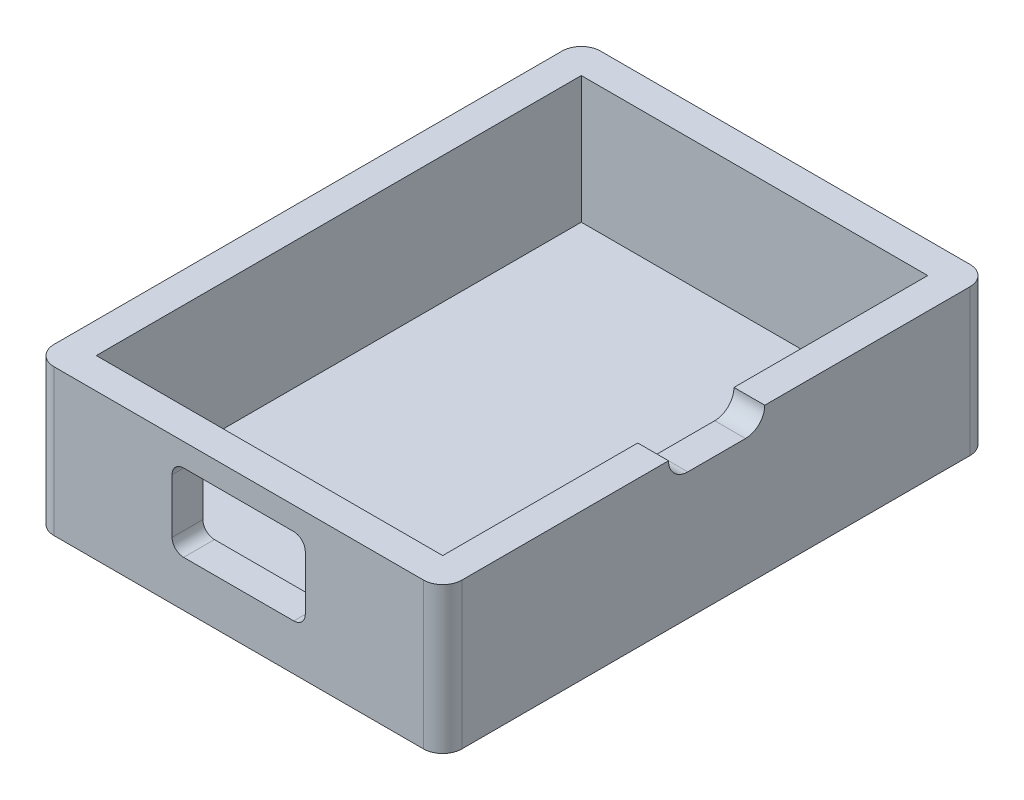
ISO-10303-21;
HEADER;
FILE_DESCRIPTION(('STEP AP214'),'2;1');
FILE_NAME('part.step','',(''),(''),'','','');
FILE_SCHEMA(('AUTOMOTIVE_DESIGN { 1 0 10303 214 1 1 1 1 }'));
ENDSEC;
DATA;
#1=APPLICATION_CONTEXT('core data for automotive mechanical design processes');
#2=APPLICATION_PROTOCOL_DEFINITION('international standard','automotive_design',2000,#1);
#3=PRODUCT_CONTEXT('',#1,'mechanical');
#4=PRODUCT('Part','Part','',(#3));
#5=PRODUCT_RELATED_PRODUCT_CATEGORY('part','',(#4));
#6=PRODUCT_DEFINITION_FORMATION('','',#4);
#7=PRODUCT_DEFINITION_CONTEXT('part definition',#1,'design');
#8=PRODUCT_DEFINITION('design','',#6,#7);
#9=PRODUCT_DEFINITION_SHAPE('','',#8);
#10=(LENGTH_UNIT() NAMED_UNIT(*) SI_UNIT(.MILLI.,.METRE.));
#11=(NAMED_UNIT(*) PLANE_ANGLE_UNIT() SI_UNIT($,.RADIAN.));
#12=(NAMED_UNIT(*) SI_UNIT($,.STERADIAN.) SOLID_ANGLE_UNIT());
#13=UNCERTAINTY_MEASURE_WITH_UNIT(LENGTH_MEASURE(1.E-05),#10,'distance_accuracy_value','');
#14=(GEOMETRIC_REPRESENTATION_CONTEXT(3) GLOBAL_UNCERTAINTY_ASSIGNED_CONTEXT((#13)) GLOBAL_UNIT_ASSIGNED_CONTEXT((#10,
#11,#12)) REPRESENTATION_CONTEXT('',''));
#15=CARTESIAN_POINT('',(0.,0.,0.));
#16=DIRECTION('',(0.,0.,1.));
#17=DIRECTION('',(1.,0.,0.));
#18=AXIS2_PLACEMENT_3D('',#15,#16,#17);
#19=CARTESIAN_POINT('',(0.,5.,0.));
#20=DIRECTION('',(0.,-1.,0.));
#21=DIRECTION('',(0.,0.,-1.));
#22=AXIS2_PLACEMENT_3D('',#19,#20,#21);
#23=PLANE('',#22);
#24=DIRECTION('',(-1.,0.,0.));
#25=VECTOR('',#24,1.);
#26=CARTESIAN_POINT('',(-45.,5.,48.));
#27=LINE('',#26,#25);
#28=CARTESIAN_POINT('',(45.,5.,48.));
#29=VERTEX_POINT('',#28);
#30=CARTESIAN_POINT('',(-45.,5.,48.));
#31=VERTEX_POINT('',#30);
#32=EDGE_CURVE('E427',#29,#31,#27,.T.);
#33=ORIENTED_EDGE('',*,*,#32,.F.);
#34=DIRECTION('',(0.,0.,1.));
#35=VECTOR('',#34,1.);
#36=CARTESIAN_POINT('',(45.,5.,-63.));
#37=LINE('',#36,#35);
#38=CARTESIAN_POINT('',(45.,5.,-63.));
#39=VERTEX_POINT('',#38);
#40=EDGE_CURVE('E454',#39,#29,#37,.T.);
#41=ORIENTED_EDGE('',*,*,#40,.F.);
#42=DIRECTION('',(1.,0.,0.));
#43=VECTOR('',#42,1.);
#44=CARTESIAN_POINT('',(-53.,5.,-63.));
#45=LINE('',#44,#43);
#46=CARTESIAN_POINT('',(-45.,5.,-63.));
#47=VERTEX_POINT('',#46);
#48=EDGE_CURVE('E483',#47,#39,#45,.T.);
#49=ORIENTED_EDGE('',*,*,#48,.F.);
#50=DIRECTION('',(0.,0.,-1.));
#51=VECTOR('',#50,1.);
#52=CARTESIAN_POINT('',(-45.,5.,-63.));
#53=LINE('',#52,#51);
#54=EDGE_CURVE('E468',#31,#47,#53,.T.);
#55=ORIENTED_EDGE('',*,*,#54,.F.);
#56=EDGE_LOOP('',(#33,#41,#49,#55));
#57=FACE_BOUND('',#56,.T.);
#58=ADVANCED_FACE('F39',(#57),#23,.F.);
#59=CARTESIAN_POINT('',(-53.,38.,63.));
#60=DIRECTION('',(0.,0.,1.));
#61=DIRECTION('',(1.,0.,0.));
#62=AXIS2_PLACEMENT_3D('',#59,#60,#61);
#63=PLANE('',#62);
#64=DIRECTION('',(0.,-1.,0.));
#65=VECTOR('',#64,1.);
#66=CARTESIAN_POINT('',(-17.3,38.,63.));
#67=LINE('',#66,#65);
#68=CARTESIAN_POINT('',(-17.3,29.05,63.));
#69=VERTEX_POINT('',#68);
#70=CARTESIAN_POINT('',(-17.3,14.95,63.));
#71=VERTEX_POINT('',#70);
#72=EDGE_CURVE('E415',#69,#71,#67,.T.);
#73=ORIENTED_EDGE('',*,*,#72,.T.);
#74=CARTESIAN_POINT('',(-14.3,14.95,63.));
#75=DIRECTION('',(0.,0.,1.));
#76=DIRECTION('',(1.,0.,0.));
#77=AXIS2_PLACEMENT_3D('',#74,#75,#76);
#78=CIRCLE('',#77,3.);
#79=CARTESIAN_POINT('',(-14.3,11.95,63.));
#80=VERTEX_POINT('',#79);
#81=EDGE_CURVE('E308',#71,#80,#78,.T.);
#82=ORIENTED_EDGE('',*,*,#81,.T.);
#83=DIRECTION('',(1.,0.,0.));
#84=VECTOR('',#83,1.);
#85=CARTESIAN_POINT('',(-53.,11.95,63.));
#86=LINE('',#85,#84);
#87=CARTESIAN_POINT('',(14.3,11.95,63.));
#88=VERTEX_POINT('',#87);
#89=EDGE_CURVE('E419',#80,#88,#86,.T.);
#90=ORIENTED_EDGE('',*,*,#89,.T.);
#91=CARTESIAN_POINT('',(14.3,14.95,63.));
#92=DIRECTION('',(0.,0.,1.));
#93=DIRECTION('',(1.,0.,0.));
#94=AXIS2_PLACEMENT_3D('',#91,#92,#93);
#95=CIRCLE('',#94,3.);
#96=CARTESIAN_POINT('',(17.3,14.95,63.));
#97=VERTEX_POINT('',#96);
#98=EDGE_CURVE('E302',#88,#97,#95,.T.);
#99=ORIENTED_EDGE('',*,*,#98,.T.);
#100=DIRECTION('',(0.,1.,0.));
#101=VECTOR('',#100,1.);
#102=CARTESIAN_POINT('',(17.3,38.,63.));
#103=LINE('',#102,#101);
#104=CARTESIAN_POINT('',(17.3,29.05,63.));
#105=VERTEX_POINT('',#104);
#106=EDGE_CURVE('E423',#97,#105,#103,.T.);
#107=ORIENTED_EDGE('',*,*,#106,.T.);
#108=CARTESIAN_POINT('',(14.3,29.05,63.));
#109=DIRECTION('',(0.,0.,1.));
#110=DIRECTION('',(1.,0.,0.));
#111=AXIS2_PLACEMENT_3D('',#108,#109,#110);
#112=CIRCLE('',#111,3.);
#113=CARTESIAN_POINT('',(14.3,32.05,63.));
#114=VERTEX_POINT('',#113);
#115=EDGE_CURVE('E296',#105,#114,#112,.T.);
#116=ORIENTED_EDGE('',*,*,#115,.T.);
#117=DIRECTION('',(-1.,0.,0.));
#118=VECTOR('',#117,1.);
#119=CARTESIAN_POINT('',(-53.,32.05,63.));
#120=LINE('',#119,#118);
#121=CARTESIAN_POINT('',(-14.3,32.05,63.));
#122=VERTEX_POINT('',#121);
#123=EDGE_CURVE('E411',#114,#122,#120,.T.);
#124=ORIENTED_EDGE('',*,*,#123,.T.);
#125=CARTESIAN_POINT('',(-14.3,29.05,63.));
#126=DIRECTION('',(0.,0.,1.));
#127=DIRECTION('',(1.,0.,0.));
#128=AXIS2_PLACEMENT_3D('',#125,#126,#127);
#129=CIRCLE('',#128,3.);
#130=EDGE_CURVE('E314',#122,#69,#129,.T.);
#131=ORIENTED_EDGE('',*,*,#130,.T.);
#132=EDGE_LOOP('',(#73,#82,#90,#99,#107,#116,#124,#131));
#133=FACE_BOUND('',#132,.T.);
#134=DIRECTION('',(1.,0.,0.));
#135=VECTOR('',#134,1.);
#136=CARTESIAN_POINT('',(-45.,10.,63.));
#137=LINE('',#136,#135);
#138=CARTESIAN_POINT('',(-45.,10.,63.));
#139=VERTEX_POINT('',#138);
#140=CARTESIAN_POINT('',(45.,10.,63.));
#141=VERTEX_POINT('',#140);
#142=EDGE_CURVE('E432',#139,#141,#137,.T.);
#143=ORIENTED_EDGE('',*,*,#142,.F.);
#144=DIRECTION('',(0.,-1.,0.));
#145=VECTOR('',#144,1.);
#146=CARTESIAN_POINT('',(-45.,38.,63.));
#147=LINE('',#146,#145);
#148=CARTESIAN_POINT('',(-45.,38.,63.));
#149=VERTEX_POINT('',#148);
#150=EDGE_CURVE('E479',#149,#139,#147,.T.);
#151=ORIENTED_EDGE('',*,*,#150,.F.);
#152=DIRECTION('',(-1.,0.,0.));
#153=VECTOR('',#152,1.);
#154=CARTESIAN_POINT('',(-53.,38.,63.));
#155=LINE('',#154,#153);
#156=CARTESIAN_POINT('',(45.,38.,63.));
#157=VERTEX_POINT('',#156);
#158=EDGE_CURVE('E242',#157,#149,#155,.T.);
#159=ORIENTED_EDGE('',*,*,#158,.F.);
#160=DIRECTION('',(0.,-1.,0.));
#161=VECTOR('',#160,1.);
#162=CARTESIAN_POINT('',(45.,38.,63.));
#163=LINE('',#162,#161);
#164=EDGE_CURVE('E457',#157,#141,#163,.T.);
#165=ORIENTED_EDGE('',*,*,#164,.T.);
#166=EDGE_LOOP('',(#143,#151,#159,#165));
#167=FACE_BOUND('',#166,.T.);
#168=ADVANCED_FACE('F536',(#133,#167),#63,.F.);
#169=CARTESIAN_POINT('',(-45.,38.,-63.));
#170=DIRECTION('',(-1.,0.,0.));
#171=DIRECTION('',(0.,0.,1.));
#172=AXIS2_PLACEMENT_3D('',#169,#170,#171);
#173=PLANE('',#172);
#174=DIRECTION('',(0.,-1.,0.));
#175=VECTOR('',#174,1.);
#176=CARTESIAN_POINT('',(-45.,10.,48.));
#177=LINE('',#176,#175);
#178=CARTESIAN_POINT('',(-45.,10.,48.));
#179=VERTEX_POINT('',#178);
#180=EDGE_CURVE('E444',#179,#31,#177,.T.);
#181=ORIENTED_EDGE('',*,*,#180,.T.);
#182=ORIENTED_EDGE('',*,*,#54,.T.);
#183=DIRECTION('',(0.,-1.,0.));
#184=VECTOR('',#183,1.);
#185=CARTESIAN_POINT('',(-45.,38.,-63.));
#186=LINE('',#185,#184);
#187=CARTESIAN_POINT('',(-45.,38.,-63.));
#188=VERTEX_POINT('',#187);
#189=EDGE_CURVE('E473',#188,#47,#186,.T.);
#190=ORIENTED_EDGE('',*,*,#189,.F.);
#191=DIRECTION('',(0.,0.,-1.));
#192=VECTOR('',#191,1.);
#193=CARTESIAN_POINT('',(-45.,38.,-63.));
#194=LINE('',#193,#192);
#195=EDGE_CURVE('E469',#149,#188,#194,.T.);
#196=ORIENTED_EDGE('',*,*,#195,.F.);
#197=ORIENTED_EDGE('',*,*,#150,.T.);
#198=DIRECTION('',(0.,0.,1.));
#199=VECTOR('',#198,1.);
#200=CARTESIAN_POINT('',(-45.,10.,63.));
#201=LINE('',#200,#199);
#202=EDGE_CURVE('E428',#179,#139,#201,.T.);
#203=ORIENTED_EDGE('',*,*,#202,.F.);
#204=EDGE_LOOP('',(#181,#182,#190,#196,#197,#203));
#205=FACE_BOUND('',#204,.T.);
#206=ADVANCED_FACE('F542',(#205),#173,.F.);
#207=CARTESIAN_POINT('',(45.,38.,-63.));
#208=DIRECTION('',(1.,0.,0.));
#209=DIRECTION('',(0.,0.,-1.));
#210=AXIS2_PLACEMENT_3D('',#207,#208,#209);
#211=PLANE('',#210);
#212=DIRECTION('',(0.,0.,1.));
#213=VECTOR('',#212,1.);
#214=CARTESIAN_POINT('',(45.,38.,-63.));
#215=LINE('',#214,#213);
#216=CARTESIAN_POINT('',(45.,38.,12.3367728383491));
#217=VERTEX_POINT('',#216);
#218=EDGE_CURVE('E458',#217,#157,#215,.T.);
#219=ORIENTED_EDGE('',*,*,#218,.F.);
#220=CARTESIAN_POINT('',(45.,38.,7.33677283834912));
#221=DIRECTION('',(1.,0.,0.));
#222=DIRECTION('',(0.,0.,-1.));
#223=AXIS2_PLACEMENT_3D('',#220,#221,#222);
#224=CIRCLE('',#223,5.);
#225=CARTESIAN_POINT('',(45.,33.,7.33677283834912));
#226=VERTEX_POINT('',#225);
#227=EDGE_CURVE('E62',#217,#226,#224,.T.);
#228=ORIENTED_EDGE('',*,*,#227,.T.);
#229=DIRECTION('',(0.,0.,-1.));
#230=VECTOR('',#229,1.);
#231=CARTESIAN_POINT('',(45.,33.,-63.));
#232=LINE('',#231,#230);
#233=CARTESIAN_POINT('',(45.,33.,-7.66322716165089));
#234=VERTEX_POINT('',#233);
#235=EDGE_CURVE('E389',#226,#234,#232,.T.);
#236=ORIENTED_EDGE('',*,*,#235,.T.);
#237=CARTESIAN_POINT('',(45.,38.,-7.66322716165089));
#238=DIRECTION('',(1.,0.,0.));
#239=DIRECTION('',(0.,0.,-1.));
#240=AXIS2_PLACEMENT_3D('',#237,#238,#239);
#241=CIRCLE('',#240,5.);
#242=CARTESIAN_POINT('',(45.,38.,-12.6632271616509));
#243=VERTEX_POINT('',#242);
#244=EDGE_CURVE('E11',#234,#243,#241,.T.);
#245=ORIENTED_EDGE('',*,*,#244,.T.);
#246=CARTESIAN_POINT('',(45.,38.,-63.));
#247=VERTEX_POINT('',#246);
#248=EDGE_CURVE('E226',#247,#243,#215,.T.);
#249=ORIENTED_EDGE('',*,*,#248,.F.);
#250=DIRECTION('',(0.,-1.,0.));
#251=VECTOR('',#250,1.);
#252=CARTESIAN_POINT('',(45.,38.,-63.));
#253=LINE('',#252,#251);
#254=EDGE_CURVE('E465',#247,#39,#253,.T.);
#255=ORIENTED_EDGE('',*,*,#254,.T.);
#256=ORIENTED_EDGE('',*,*,#40,.T.);
#257=DIRECTION('',(0.,-1.,0.));
#258=VECTOR('',#257,1.);
#259=CARTESIAN_POINT('',(45.,10.,48.));
#260=LINE('',#259,#258);
#261=CARTESIAN_POINT('',(45.,10.,48.));
#262=VERTEX_POINT('',#261);
#263=EDGE_CURVE('E450',#262,#29,#260,.T.);
#264=ORIENTED_EDGE('',*,*,#263,.F.);
#265=DIRECTION('',(0.,0.,-1.));
#266=VECTOR('',#265,1.);
#267=CARTESIAN_POINT('',(45.,10.,63.));
#268=LINE('',#267,#266);
#269=EDGE_CURVE('E436',#141,#262,#268,.T.);
#270=ORIENTED_EDGE('',*,*,#269,.F.);
#271=ORIENTED_EDGE('',*,*,#164,.F.);
#272=EDGE_LOOP('',(#219,#228,#236,#245,#249,#255,#256,#264,#270,#271));
#273=FACE_BOUND('',#272,.T.);
#274=ADVANCED_FACE('F562',(#273),#211,.F.);
#275=CARTESIAN_POINT('',(-53.,38.,-63.));
#276=DIRECTION('',(0.,0.,-1.));
#277=DIRECTION('',(-1.,0.,0.));
#278=AXIS2_PLACEMENT_3D('',#275,#276,#277);
#279=PLANE('',#278);
#280=ORIENTED_EDGE('',*,*,#254,.F.);
#281=DIRECTION('',(1.,0.,0.));
#282=VECTOR('',#281,1.);
#283=CARTESIAN_POINT('',(-53.,38.,-63.));
#284=LINE('',#283,#282);
#285=EDGE_CURVE('E484',#188,#247,#284,.T.);
#286=ORIENTED_EDGE('',*,*,#285,.F.);
#287=ORIENTED_EDGE('',*,*,#189,.T.);
#288=ORIENTED_EDGE('',*,*,#48,.T.);
#289=EDGE_LOOP('',(#280,#286,#287,#288));
#290=FACE_BOUND('',#289,.T.);
#291=ADVANCED_FACE('F559',(#290),#279,.F.);
#292=CARTESIAN_POINT('',(53.,5.,71.));
#293=DIRECTION('',(-1.,0.,0.));
#294=DIRECTION('',(0.,0.,1.));
#295=AXIS2_PLACEMENT_3D('',#292,#293,#294);
#296=PLANE('',#295);
#297=DIRECTION('',(0.,0.,-1.));
#298=VECTOR('',#297,1.);
#299=CARTESIAN_POINT('',(53.,38.,71.));
#300=LINE('',#299,#298);
#301=CARTESIAN_POINT('',(53.,38.,-12.6632271616509));
#302=VERTEX_POINT('',#301);
#303=CARTESIAN_POINT('',(53.,38.,-66.));
#304=VERTEX_POINT('',#303);
#305=EDGE_CURVE('E223',#302,#304,#300,.T.);
#306=ORIENTED_EDGE('',*,*,#305,.F.);
#307=CARTESIAN_POINT('',(53.,38.,-7.66322716165089));
#308=DIRECTION('',(-1.,0.,0.));
#309=DIRECTION('',(0.,0.,1.));
#310=AXIS2_PLACEMENT_3D('',#307,#308,#309);
#311=CIRCLE('',#310,5.);
#312=CARTESIAN_POINT('',(53.,33.,-7.66322716165089));
#313=VERTEX_POINT('',#312);
#314=EDGE_CURVE('E48',#302,#313,#311,.T.);
#315=ORIENTED_EDGE('',*,*,#314,.T.);
#316=DIRECTION('',(0.,0.,-1.));
#317=VECTOR('',#316,1.);
#318=CARTESIAN_POINT('',(53.,33.,12.3367728383491));
#319=LINE('',#318,#317);
#320=CARTESIAN_POINT('',(53.,33.,7.33677283834912));
#321=VERTEX_POINT('',#320);
#322=EDGE_CURVE('E382',#321,#313,#319,.T.);
#323=ORIENTED_EDGE('',*,*,#322,.F.);
#324=CARTESIAN_POINT('',(53.,38.,7.33677283834912));
#325=DIRECTION('',(-1.,0.,0.));
#326=DIRECTION('',(0.,0.,1.));
#327=AXIS2_PLACEMENT_3D('',#324,#325,#326);
#328=CIRCLE('',#327,5.);
#329=CARTESIAN_POINT('',(53.,38.,12.3367728383491));
#330=VERTEX_POINT('',#329);
#331=EDGE_CURVE('E376',#321,#330,#328,.T.);
#332=ORIENTED_EDGE('',*,*,#331,.T.);
#333=CARTESIAN_POINT('',(53.,38.,66.));
#334=VERTEX_POINT('',#333);
#335=EDGE_CURVE('E236',#334,#330,#300,.T.);
#336=ORIENTED_EDGE('',*,*,#335,.F.);
#337=DIRECTION('',(0.,-1.,0.));
#338=VECTOR('',#337,1.);
#339=CARTESIAN_POINT('',(53.,5.,66.));
#340=LINE('',#339,#338);
#341=CARTESIAN_POINT('',(53.,0.,66.));
#342=VERTEX_POINT('',#341);
#343=EDGE_CURVE('E357',#334,#342,#340,.T.);
#344=ORIENTED_EDGE('',*,*,#343,.T.);
#345=DIRECTION('',(0.,0.,-1.));
#346=VECTOR('',#345,1.);
#347=CARTESIAN_POINT('',(53.,0.,71.));
#348=LINE('',#347,#346);
#349=CARTESIAN_POINT('',(53.,0.,-66.));
#350=VERTEX_POINT('',#349);
#351=EDGE_CURVE('E250',#342,#350,#348,.T.);
#352=ORIENTED_EDGE('',*,*,#351,.T.);
#353=DIRECTION('',(0.,-1.,0.));
#354=VECTOR('',#353,1.);
#355=CARTESIAN_POINT('',(53.,5.,-66.));
#356=LINE('',#355,#354);
#357=EDGE_CURVE('E233',#350,#304,#356,.F.);
#358=ORIENTED_EDGE('',*,*,#357,.T.);
#359=EDGE_LOOP('',(#306,#315,#323,#332,#336,#344,#352,#358));
#360=FACE_BOUND('',#359,.T.);
#361=ADVANCED_FACE('F230',(#360),#296,.F.);
#362=CARTESIAN_POINT('',(-53.,5.,-71.));
#363=DIRECTION('',(0.,0.,1.));
#364=DIRECTION('',(1.,0.,0.));
#365=AXIS2_PLACEMENT_3D('',#362,#363,#364);
#366=PLANE('',#365);
#367=DIRECTION('',(-1.,0.,0.));
#368=VECTOR('',#367,1.);
#369=CARTESIAN_POINT('',(-53.,38.,-71.));
#370=LINE('',#369,#368);
#371=CARTESIAN_POINT('',(48.,38.,-71.));
#372=VERTEX_POINT('',#371);
#373=CARTESIAN_POINT('',(-48.,38.,-71.));
#374=VERTEX_POINT('',#373);
#375=EDGE_CURVE('E487',#372,#374,#370,.T.);
#376=ORIENTED_EDGE('',*,*,#375,.F.);
#377=DIRECTION('',(0.,-1.,0.));
#378=VECTOR('',#377,1.);
#379=CARTESIAN_POINT('',(48.,5.,-71.));
#380=LINE('',#379,#378);
#381=CARTESIAN_POINT('',(48.,0.,-71.));
#382=VERTEX_POINT('',#381);
#383=EDGE_CURVE('E364',#372,#382,#380,.T.);
#384=ORIENTED_EDGE('',*,*,#383,.T.);
#385=DIRECTION('',(-1.,0.,0.));
#386=VECTOR('',#385,1.);
#387=CARTESIAN_POINT('',(-53.,0.,-71.));
#388=LINE('',#387,#386);
#389=CARTESIAN_POINT('',(-48.,0.,-71.));
#390=VERTEX_POINT('',#389);
#391=EDGE_CURVE('E253',#382,#390,#388,.T.);
#392=ORIENTED_EDGE('',*,*,#391,.T.);
#393=DIRECTION('',(0.,-1.,0.));
#394=VECTOR('',#393,1.);
#395=CARTESIAN_POINT('',(-48.,5.,-71.));
#396=LINE('',#395,#394);
#397=EDGE_CURVE('E361',#390,#374,#396,.F.);
#398=ORIENTED_EDGE('',*,*,#397,.T.);
#399=EDGE_LOOP('',(#376,#384,#392,#398));
#400=FACE_BOUND('',#399,.T.);
#401=ADVANCED_FACE('F520',(#400),#366,.F.);
#402=CARTESIAN_POINT('',(-53.,5.,71.));
#403=DIRECTION('',(1.,0.,0.));
#404=DIRECTION('',(0.,0.,-1.));
#405=AXIS2_PLACEMENT_3D('',#402,#403,#404);
#406=PLANE('',#405);
#407=DIRECTION('',(0.,0.,1.));
#408=VECTOR('',#407,1.);
#409=CARTESIAN_POINT('',(-53.,0.,71.));
#410=LINE('',#409,#408);
#411=CARTESIAN_POINT('',(-53.,0.,-66.));
#412=VERTEX_POINT('',#411);
#413=CARTESIAN_POINT('',(-53.,0.,66.));
#414=VERTEX_POINT('',#413);
#415=EDGE_CURVE('E257',#412,#414,#410,.T.);
#416=ORIENTED_EDGE('',*,*,#415,.T.);
#417=DIRECTION('',(0.,-1.,0.));
#418=VECTOR('',#417,1.);
#419=CARTESIAN_POINT('',(-53.,5.,66.));
#420=LINE('',#419,#418);
#421=CARTESIAN_POINT('',(-53.,38.,66.));
#422=VERTEX_POINT('',#421);
#423=EDGE_CURVE('E340',#414,#422,#420,.F.);
#424=ORIENTED_EDGE('',*,*,#423,.T.);
#425=DIRECTION('',(0.,0.,1.));
#426=VECTOR('',#425,1.);
#427=CARTESIAN_POINT('',(-53.,38.,71.));
#428=LINE('',#427,#426);
#429=CARTESIAN_POINT('',(-53.,38.,-66.));
#430=VERTEX_POINT('',#429);
#431=EDGE_CURVE('E244',#430,#422,#428,.T.);
#432=ORIENTED_EDGE('',*,*,#431,.F.);
#433=DIRECTION('',(0.,-1.,0.));
#434=VECTOR('',#433,1.);
#435=CARTESIAN_POINT('',(-53.,5.,-66.));
#436=LINE('',#435,#434);
#437=EDGE_CURVE('E336',#430,#412,#436,.T.);
#438=ORIENTED_EDGE('',*,*,#437,.T.);
#439=EDGE_LOOP('',(#416,#424,#432,#438));
#440=FACE_BOUND('',#439,.T.);
#441=ADVANCED_FACE('F525',(#440),#406,.F.);
#442=CARTESIAN_POINT('',(-53.,5.,71.));
#443=DIRECTION('',(0.,0.,-1.));
#444=DIRECTION('',(-1.,0.,0.));
#445=AXIS2_PLACEMENT_3D('',#442,#443,#444);
#446=PLANE('',#445);
#447=DIRECTION('',(-1.,0.,0.));
#448=VECTOR('',#447,1.);
#449=CARTESIAN_POINT('',(-17.3,32.05,71.));
#450=LINE('',#449,#448);
#451=CARTESIAN_POINT('',(14.3,32.05,71.));
#452=VERTEX_POINT('',#451);
#453=CARTESIAN_POINT('',(-14.3,32.05,71.));
#454=VERTEX_POINT('',#453);
#455=EDGE_CURVE('E396',#452,#454,#450,.T.);
#456=ORIENTED_EDGE('',*,*,#455,.F.);
#457=CARTESIAN_POINT('',(14.3,29.05,71.));
#458=DIRECTION('',(0.,0.,-1.));
#459=DIRECTION('',(-1.,0.,0.));
#460=AXIS2_PLACEMENT_3D('',#457,#458,#459);
#461=CIRCLE('',#460,3.);
#462=CARTESIAN_POINT('',(17.3,29.05,71.));
#463=VERTEX_POINT('',#462);
#464=EDGE_CURVE('E293',#452,#463,#461,.T.);
#465=ORIENTED_EDGE('',*,*,#464,.T.);
#466=DIRECTION('',(0.,1.,0.));
#467=VECTOR('',#466,1.);
#468=CARTESIAN_POINT('',(17.3,11.95,71.));
#469=LINE('',#468,#467);
#470=CARTESIAN_POINT('',(17.3,14.95,71.));
#471=VERTEX_POINT('',#470);
#472=EDGE_CURVE('E391',#471,#463,#469,.T.);
#473=ORIENTED_EDGE('',*,*,#472,.F.);
#474=CARTESIAN_POINT('',(14.3,14.95,71.));
#475=DIRECTION('',(0.,0.,-1.));
#476=DIRECTION('',(-1.,0.,0.));
#477=AXIS2_PLACEMENT_3D('',#474,#475,#476);
#478=CIRCLE('',#477,3.);
#479=CARTESIAN_POINT('',(14.3,11.95,71.));
#480=VERTEX_POINT('',#479);
#481=EDGE_CURVE('E299',#471,#480,#478,.T.);
#482=ORIENTED_EDGE('',*,*,#481,.T.);
#483=DIRECTION('',(1.,0.,0.));
#484=VECTOR('',#483,1.);
#485=CARTESIAN_POINT('',(-17.3,11.95,71.));
#486=LINE('',#485,#484);
#487=CARTESIAN_POINT('',(-14.3,11.95,71.));
#488=VERTEX_POINT('',#487);
#489=EDGE_CURVE('E407',#488,#480,#486,.T.);
#490=ORIENTED_EDGE('',*,*,#489,.F.);
#491=CARTESIAN_POINT('',(-14.3,14.95,71.));
#492=DIRECTION('',(0.,0.,-1.));
#493=DIRECTION('',(-1.,0.,0.));
#494=AXIS2_PLACEMENT_3D('',#491,#492,#493);
#495=CIRCLE('',#494,3.);
#496=CARTESIAN_POINT('',(-17.3,14.95,71.));
#497=VERTEX_POINT('',#496);
#498=EDGE_CURVE('E305',#488,#497,#495,.T.);
#499=ORIENTED_EDGE('',*,*,#498,.T.);
#500=DIRECTION('',(0.,-1.,0.));
#501=VECTOR('',#500,1.);
#502=CARTESIAN_POINT('',(-17.3,11.95,71.));
#503=LINE('',#502,#501);
#504=CARTESIAN_POINT('',(-17.3,29.05,71.));
#505=VERTEX_POINT('',#504);
#506=EDGE_CURVE('E403',#505,#497,#503,.T.);
#507=ORIENTED_EDGE('',*,*,#506,.F.);
#508=CARTESIAN_POINT('',(-14.3,29.05,71.));
#509=DIRECTION('',(0.,0.,-1.));
#510=DIRECTION('',(-1.,0.,0.));
#511=AXIS2_PLACEMENT_3D('',#508,#509,#510);
#512=CIRCLE('',#511,3.);
#513=EDGE_CURVE('E311',#505,#454,#512,.T.);
#514=ORIENTED_EDGE('',*,*,#513,.T.);
#515=EDGE_LOOP('',(#456,#465,#473,#482,#490,#499,#507,#514));
#516=FACE_BOUND('',#515,.T.);
#517=DIRECTION('',(1.,0.,0.));
#518=VECTOR('',#517,1.);
#519=CARTESIAN_POINT('',(-53.,38.,71.));
#520=LINE('',#519,#518);
#521=CARTESIAN_POINT('',(-48.,38.,71.));
#522=VERTEX_POINT('',#521);
#523=CARTESIAN_POINT('',(48.,38.,71.));
#524=VERTEX_POINT('',#523);
#525=EDGE_CURVE('E237',#522,#524,#520,.T.);
#526=ORIENTED_EDGE('',*,*,#525,.F.);
#527=DIRECTION('',(0.,-1.,0.));
#528=VECTOR('',#527,1.);
#529=CARTESIAN_POINT('',(-48.,5.,71.));
#530=LINE('',#529,#528);
#531=CARTESIAN_POINT('',(-48.,0.,71.));
#532=VERTEX_POINT('',#531);
#533=EDGE_CURVE('E320',#522,#532,#530,.T.);
#534=ORIENTED_EDGE('',*,*,#533,.T.);
#535=DIRECTION('',(1.,0.,0.));
#536=VECTOR('',#535,1.);
#537=CARTESIAN_POINT('',(-53.,0.,71.));
#538=LINE('',#537,#536);
#539=CARTESIAN_POINT('',(48.,0.,71.));
#540=VERTEX_POINT('',#539);
#541=EDGE_CURVE('E261',#532,#540,#538,.T.);
#542=ORIENTED_EDGE('',*,*,#541,.T.);
#543=DIRECTION('',(0.,-1.,0.));
#544=VECTOR('',#543,1.);
#545=CARTESIAN_POINT('',(48.,5.,71.));
#546=LINE('',#545,#544);
#547=EDGE_CURVE('E317',#540,#524,#546,.F.);
#548=ORIENTED_EDGE('',*,*,#547,.T.);
#549=EDGE_LOOP('',(#526,#534,#542,#548));
#550=FACE_BOUND('',#549,.T.);
#551=ADVANCED_FACE('F507',(#516,#550),#446,.F.);
#552=CARTESIAN_POINT('',(0.,0.,0.));
#553=DIRECTION('',(0.,-1.,0.));
#554=DIRECTION('',(0.,0.,-1.));
#555=AXIS2_PLACEMENT_3D('',#552,#553,#554);
#556=PLANE('',#555);
#557=ORIENTED_EDGE('',*,*,#541,.F.);
#558=CARTESIAN_POINT('',(-48.,0.,66.));
#559=DIRECTION('',(0.,-1.,0.));
#560=DIRECTION('',(0.,0.,-1.));
#561=AXIS2_PLACEMENT_3D('',#558,#559,#560);
#562=CIRCLE('',#561,5.);
#563=EDGE_CURVE('E333',#532,#414,#562,.T.);
#564=ORIENTED_EDGE('',*,*,#563,.T.);
#565=ORIENTED_EDGE('',*,*,#415,.F.);
#566=CARTESIAN_POINT('',(-48.,0.,-66.));
#567=DIRECTION('',(0.,-1.,0.));
#568=DIRECTION('',(0.,0.,-1.));
#569=AXIS2_PLACEMENT_3D('',#566,#567,#568);
#570=CIRCLE('',#569,5.);
#571=EDGE_CURVE('E324',#412,#390,#570,.T.);
#572=ORIENTED_EDGE('',*,*,#571,.T.);
#573=ORIENTED_EDGE('',*,*,#391,.F.);
#574=CARTESIAN_POINT('',(48.,0.,-66.));
#575=DIRECTION('',(0.,-1.,0.));
#576=DIRECTION('',(0.,0.,-1.));
#577=AXIS2_PLACEMENT_3D('',#574,#575,#576);
#578=CIRCLE('',#577,5.);
#579=EDGE_CURVE('E327',#382,#350,#578,.T.);
#580=ORIENTED_EDGE('',*,*,#579,.T.);
#581=ORIENTED_EDGE('',*,*,#351,.F.);
#582=CARTESIAN_POINT('',(48.,0.,66.));
#583=DIRECTION('',(0.,-1.,0.));
#584=DIRECTION('',(0.,0.,-1.));
#585=AXIS2_PLACEMENT_3D('',#582,#583,#584);
#586=CIRCLE('',#585,5.);
#587=EDGE_CURVE('E330',#342,#540,#586,.T.);
#588=ORIENTED_EDGE('',*,*,#587,.T.);
#589=EDGE_LOOP('',(#557,#564,#565,#572,#573,#580,#581,#588));
#590=FACE_BOUND('',#589,.T.);
#591=ADVANCED_FACE('F510',(#590),#556,.T.);
#592=CARTESIAN_POINT('',(0.,38.,0.));
#593=DIRECTION('',(0.,-1.,0.));
#594=DIRECTION('',(0.,0.,-1.));
#595=AXIS2_PLACEMENT_3D('',#592,#593,#594);
#596=PLANE('',#595);
#597=ORIENTED_EDGE('',*,*,#248,.T.);
#598=DIRECTION('',(1.,0.,0.));
#599=VECTOR('',#598,1.);
#600=CARTESIAN_POINT('',(0.,38.,-12.6632271616509));
#601=LINE('',#600,#599);
#602=EDGE_CURVE('E215',#243,#302,#601,.T.);
#603=ORIENTED_EDGE('',*,*,#602,.T.);
#604=ORIENTED_EDGE('',*,*,#305,.T.);
#605=CARTESIAN_POINT('',(48.,38.,-66.));
#606=DIRECTION('',(0.,-1.,0.));
#607=DIRECTION('',(0.,0.,-1.));
#608=AXIS2_PLACEMENT_3D('',#605,#606,#607);
#609=CIRCLE('',#608,5.);
#610=EDGE_CURVE('E346',#304,#372,#609,.F.);
#611=ORIENTED_EDGE('',*,*,#610,.T.);
#612=ORIENTED_EDGE('',*,*,#375,.T.);
#613=CARTESIAN_POINT('',(-48.,38.,-66.));
#614=DIRECTION('',(0.,-1.,0.));
#615=DIRECTION('',(0.,0.,-1.));
#616=AXIS2_PLACEMENT_3D('',#613,#614,#615);
#617=CIRCLE('',#616,5.);
#618=EDGE_CURVE('E343',#374,#430,#617,.F.);
#619=ORIENTED_EDGE('',*,*,#618,.T.);
#620=ORIENTED_EDGE('',*,*,#431,.T.);
#621=CARTESIAN_POINT('',(-48.,38.,66.));
#622=DIRECTION('',(0.,-1.,0.));
#623=DIRECTION('',(0.,0.,-1.));
#624=AXIS2_PLACEMENT_3D('',#621,#622,#623);
#625=CIRCLE('',#624,5.);
#626=EDGE_CURVE('E352',#422,#522,#625,.F.);
#627=ORIENTED_EDGE('',*,*,#626,.T.);
#628=ORIENTED_EDGE('',*,*,#525,.T.);
#629=CARTESIAN_POINT('',(48.,38.,66.));
#630=DIRECTION('',(0.,-1.,0.));
#631=DIRECTION('',(0.,0.,-1.));
#632=AXIS2_PLACEMENT_3D('',#629,#630,#631);
#633=CIRCLE('',#632,5.);
#634=EDGE_CURVE('E349',#524,#334,#633,.F.);
#635=ORIENTED_EDGE('',*,*,#634,.T.);
#636=ORIENTED_EDGE('',*,*,#335,.T.);
#637=DIRECTION('',(-1.,0.,0.));
#638=VECTOR('',#637,1.);
#639=CARTESIAN_POINT('',(0.,38.,12.3367728383491));
#640=LINE('',#639,#638);
#641=EDGE_CURVE('E228',#330,#217,#640,.T.);
#642=ORIENTED_EDGE('',*,*,#641,.T.);
#643=ORIENTED_EDGE('',*,*,#218,.T.);
#644=ORIENTED_EDGE('',*,*,#158,.T.);
#645=ORIENTED_EDGE('',*,*,#195,.T.);
#646=ORIENTED_EDGE('',*,*,#285,.T.);
#647=EDGE_LOOP('',(#597,#603,#604,#611,#612,#619,#620,#627,#628,#635,#636,#642,#643,#644,#645,#646));
#648=FACE_BOUND('',#647,.T.);
#649=ADVANCED_FACE('F222',(#648),#596,.F.);
#650=CARTESIAN_POINT('',(-45.,10.,48.));
#651=DIRECTION('',(0.,0.,1.));
#652=DIRECTION('',(1.,0.,0.));
#653=AXIS2_PLACEMENT_3D('',#650,#651,#652);
#654=PLANE('',#653);
#655=ORIENTED_EDGE('',*,*,#32,.T.);
#656=ORIENTED_EDGE('',*,*,#180,.F.);
#657=DIRECTION('',(-1.,0.,0.));
#658=VECTOR('',#657,1.);
#659=CARTESIAN_POINT('',(-45.,10.,48.));
#660=LINE('',#659,#658);
#661=EDGE_CURVE('E440',#262,#179,#660,.T.);
#662=ORIENTED_EDGE('',*,*,#661,.F.);
#663=ORIENTED_EDGE('',*,*,#263,.T.);
#664=EDGE_LOOP('',(#655,#656,#662,#663));
#665=FACE_BOUND('',#664,.T.);
#666=ADVANCED_FACE('F551',(#665),#654,.F.);
#667=CARTESIAN_POINT('',(0.,10.,0.));
#668=DIRECTION('',(0.,-1.,0.));
#669=DIRECTION('',(0.,0.,-1.));
#670=AXIS2_PLACEMENT_3D('',#667,#668,#669);
#671=PLANE('',#670);
#672=ORIENTED_EDGE('',*,*,#202,.T.);
#673=ORIENTED_EDGE('',*,*,#142,.T.);
#674=ORIENTED_EDGE('',*,*,#269,.T.);
#675=ORIENTED_EDGE('',*,*,#661,.T.);
#676=EDGE_LOOP('',(#672,#673,#674,#675));
#677=FACE_BOUND('',#676,.T.);
#678=ADVANCED_FACE('F555',(#677),#671,.F.);
#679=CARTESIAN_POINT('',(17.3,11.95,61.));
#680=DIRECTION('',(1.,0.,0.));
#681=DIRECTION('',(0.,0.,-1.));
#682=AXIS2_PLACEMENT_3D('',#679,#680,#681);
#683=PLANE('',#682);
#684=ORIENTED_EDGE('',*,*,#472,.T.);
#685=DIRECTION('',(0.,0.,1.));
#686=VECTOR('',#685,1.);
#687=CARTESIAN_POINT('',(17.3,29.05,63.));
#688=LINE('',#687,#686);
#689=EDGE_CURVE('E276',#463,#105,#688,.F.);
#690=ORIENTED_EDGE('',*,*,#689,.T.);
#691=ORIENTED_EDGE('',*,*,#106,.F.);
#692=DIRECTION('',(0.,0.,1.));
#693=VECTOR('',#692,1.);
#694=CARTESIAN_POINT('',(17.3,14.95,71.));
#695=LINE('',#694,#693);
#696=EDGE_CURVE('E272',#97,#471,#695,.T.);
#697=ORIENTED_EDGE('',*,*,#696,.T.);
#698=EDGE_LOOP('',(#684,#690,#691,#697));
#699=FACE_BOUND('',#698,.T.);
#700=ADVANCED_FACE('F571',(#699),#683,.F.);
#701=CARTESIAN_POINT('',(-17.3,11.95,61.));
#702=DIRECTION('',(0.,-1.,0.));
#703=DIRECTION('',(0.,0.,-1.));
#704=AXIS2_PLACEMENT_3D('',#701,#702,#703);
#705=PLANE('',#704);
#706=ORIENTED_EDGE('',*,*,#489,.T.);
#707=DIRECTION('',(0.,0.,1.));
#708=VECTOR('',#707,1.);
#709=CARTESIAN_POINT('',(14.3,11.95,63.));
#710=LINE('',#709,#708);
#711=EDGE_CURVE('E283',#480,#88,#710,.F.);
#712=ORIENTED_EDGE('',*,*,#711,.T.);
#713=ORIENTED_EDGE('',*,*,#89,.F.);
#714=DIRECTION('',(0.,0.,1.));
#715=VECTOR('',#714,1.);
#716=CARTESIAN_POINT('',(-14.3,11.95,71.));
#717=LINE('',#716,#715);
#718=EDGE_CURVE('E279',#80,#488,#717,.T.);
#719=ORIENTED_EDGE('',*,*,#718,.T.);
#720=EDGE_LOOP('',(#706,#712,#713,#719));
#721=FACE_BOUND('',#720,.T.);
#722=ADVANCED_FACE('F575',(#721),#705,.F.);
#723=CARTESIAN_POINT('',(-17.3,11.95,61.));
#724=DIRECTION('',(-1.,0.,0.));
#725=DIRECTION('',(0.,0.,1.));
#726=AXIS2_PLACEMENT_3D('',#723,#724,#725);
#727=PLANE('',#726);
#728=ORIENTED_EDGE('',*,*,#506,.T.);
#729=DIRECTION('',(0.,0.,1.));
#730=VECTOR('',#729,1.);
#731=CARTESIAN_POINT('',(-17.3,14.95,63.));
#732=LINE('',#731,#730);
#733=EDGE_CURVE('E290',#497,#71,#732,.F.);
#734=ORIENTED_EDGE('',*,*,#733,.T.);
#735=ORIENTED_EDGE('',*,*,#72,.F.);
#736=DIRECTION('',(0.,0.,1.));
#737=VECTOR('',#736,1.);
#738=CARTESIAN_POINT('',(-17.3,29.05,71.));
#739=LINE('',#738,#737);
#740=EDGE_CURVE('E286',#69,#505,#739,.T.);
#741=ORIENTED_EDGE('',*,*,#740,.T.);
#742=EDGE_LOOP('',(#728,#734,#735,#741));
#743=FACE_BOUND('',#742,.T.);
#744=ADVANCED_FACE('F581',(#743),#727,.F.);
#745=CARTESIAN_POINT('',(-17.3,32.05,61.));
#746=DIRECTION('',(0.,1.,0.));
#747=DIRECTION('',(0.,0.,1.));
#748=AXIS2_PLACEMENT_3D('',#745,#746,#747);
#749=PLANE('',#748);
#750=ORIENTED_EDGE('',*,*,#123,.F.);
#751=DIRECTION('',(0.,0.,1.));
#752=VECTOR('',#751,1.);
#753=CARTESIAN_POINT('',(14.3,32.05,71.));
#754=LINE('',#753,#752);
#755=EDGE_CURVE('E268',#114,#452,#754,.T.);
#756=ORIENTED_EDGE('',*,*,#755,.T.);
#757=ORIENTED_EDGE('',*,*,#455,.T.);
#758=DIRECTION('',(0.,0.,1.));
#759=VECTOR('',#758,1.);
#760=CARTESIAN_POINT('',(-14.3,32.05,63.));
#761=LINE('',#760,#759);
#762=EDGE_CURVE('E265',#454,#122,#761,.F.);
#763=ORIENTED_EDGE('',*,*,#762,.T.);
#764=EDGE_LOOP('',(#750,#756,#757,#763));
#765=FACE_BOUND('',#764,.T.);
#766=ADVANCED_FACE('F577',(#765),#749,.F.);
#767=CARTESIAN_POINT('',(14.3,29.05,61.));
#768=DIRECTION('',(0.,0.,-1.));
#769=DIRECTION('',(-1.,0.,0.));
#770=AXIS2_PLACEMENT_3D('',#767,#768,#769);
#771=CYLINDRICAL_SURFACE('',#770,3.);
#772=ORIENTED_EDGE('',*,*,#115,.F.);
#773=ORIENTED_EDGE('',*,*,#689,.F.);
#774=ORIENTED_EDGE('',*,*,#464,.F.);
#775=ORIENTED_EDGE('',*,*,#755,.F.);
#776=EDGE_LOOP('',(#772,#773,#774,#775));
#777=FACE_BOUND('',#776,.T.);
#778=ADVANCED_FACE('F580',(#777),#771,.F.);
#779=CARTESIAN_POINT('',(14.3,14.95,61.));
#780=DIRECTION('',(0.,0.,-1.));
#781=DIRECTION('',(-1.,0.,0.));
#782=AXIS2_PLACEMENT_3D('',#779,#780,#781);
#783=CYLINDRICAL_SURFACE('',#782,3.);
#784=ORIENTED_EDGE('',*,*,#98,.F.);
#785=ORIENTED_EDGE('',*,*,#711,.F.);
#786=ORIENTED_EDGE('',*,*,#481,.F.);
#787=ORIENTED_EDGE('',*,*,#696,.F.);
#788=EDGE_LOOP('',(#784,#785,#786,#787));
#789=FACE_BOUND('',#788,.T.);
#790=ADVANCED_FACE('F611',(#789),#783,.F.);
#791=CARTESIAN_POINT('',(-14.3,14.95,61.));
#792=DIRECTION('',(0.,0.,-1.));
#793=DIRECTION('',(-1.,0.,0.));
#794=AXIS2_PLACEMENT_3D('',#791,#792,#793);
#795=CYLINDRICAL_SURFACE('',#794,3.);
#796=ORIENTED_EDGE('',*,*,#81,.F.);
#797=ORIENTED_EDGE('',*,*,#733,.F.);
#798=ORIENTED_EDGE('',*,*,#498,.F.);
#799=ORIENTED_EDGE('',*,*,#718,.F.);
#800=EDGE_LOOP('',(#796,#797,#798,#799));
#801=FACE_BOUND('',#800,.T.);
#802=ADVANCED_FACE('F607',(#801),#795,.F.);
#803=CARTESIAN_POINT('',(-14.3,29.05,61.));
#804=DIRECTION('',(0.,0.,-1.));
#805=DIRECTION('',(-1.,0.,0.));
#806=AXIS2_PLACEMENT_3D('',#803,#804,#805);
#807=CYLINDRICAL_SURFACE('',#806,3.);
#808=ORIENTED_EDGE('',*,*,#130,.F.);
#809=ORIENTED_EDGE('',*,*,#762,.F.);
#810=ORIENTED_EDGE('',*,*,#513,.F.);
#811=ORIENTED_EDGE('',*,*,#740,.F.);
#812=EDGE_LOOP('',(#808,#809,#810,#811));
#813=FACE_BOUND('',#812,.T.);
#814=ADVANCED_FACE('F604',(#813),#807,.F.);
#815=CARTESIAN_POINT('',(-48.,5.,66.));
#816=DIRECTION('',(0.,-1.,0.));
#817=DIRECTION('',(0.,0.,-1.));
#818=AXIS2_PLACEMENT_3D('',#815,#816,#817);
#819=CYLINDRICAL_SURFACE('',#818,5.);
#820=ORIENTED_EDGE('',*,*,#626,.F.);
#821=ORIENTED_EDGE('',*,*,#423,.F.);
#822=ORIENTED_EDGE('',*,*,#563,.F.);
#823=ORIENTED_EDGE('',*,*,#533,.F.);
#824=EDGE_LOOP('',(#820,#821,#822,#823));
#825=FACE_BOUND('',#824,.T.);
#826=ADVANCED_FACE('F504',(#825),#819,.T.);
#827=CARTESIAN_POINT('',(48.,5.,66.));
#828=DIRECTION('',(0.,-1.,0.));
#829=DIRECTION('',(0.,0.,-1.));
#830=AXIS2_PLACEMENT_3D('',#827,#828,#829);
#831=CYLINDRICAL_SURFACE('',#830,5.);
#832=ORIENTED_EDGE('',*,*,#634,.F.);
#833=ORIENTED_EDGE('',*,*,#547,.F.);
#834=ORIENTED_EDGE('',*,*,#587,.F.);
#835=ORIENTED_EDGE('',*,*,#343,.F.);
#836=EDGE_LOOP('',(#832,#833,#834,#835));
#837=FACE_BOUND('',#836,.T.);
#838=ADVANCED_FACE('F514',(#837),#831,.T.);
#839=CARTESIAN_POINT('',(48.,5.,-66.));
#840=DIRECTION('',(0.,-1.,0.));
#841=DIRECTION('',(0.,0.,-1.));
#842=AXIS2_PLACEMENT_3D('',#839,#840,#841);
#843=CYLINDRICAL_SURFACE('',#842,5.);
#844=ORIENTED_EDGE('',*,*,#610,.F.);
#845=ORIENTED_EDGE('',*,*,#357,.F.);
#846=ORIENTED_EDGE('',*,*,#579,.F.);
#847=ORIENTED_EDGE('',*,*,#383,.F.);
#848=EDGE_LOOP('',(#844,#845,#846,#847));
#849=FACE_BOUND('',#848,.T.);
#850=ADVANCED_FACE('F516',(#849),#843,.T.);
#851=CARTESIAN_POINT('',(-48.,5.,-66.));
#852=DIRECTION('',(0.,-1.,0.));
#853=DIRECTION('',(0.,0.,-1.));
#854=AXIS2_PLACEMENT_3D('',#851,#852,#853);
#855=CYLINDRICAL_SURFACE('',#854,5.);
#856=ORIENTED_EDGE('',*,*,#618,.F.);
#857=ORIENTED_EDGE('',*,*,#397,.F.);
#858=ORIENTED_EDGE('',*,*,#571,.F.);
#859=ORIENTED_EDGE('',*,*,#437,.F.);
#860=EDGE_LOOP('',(#856,#857,#858,#859));
#861=FACE_BOUND('',#860,.T.);
#862=ADVANCED_FACE('F524',(#861),#855,.T.);
#863=CARTESIAN_POINT('',(43.,33.,12.3367728383491));
#864=DIRECTION('',(0.,-1.,0.));
#865=DIRECTION('',(0.,0.,-1.));
#866=AXIS2_PLACEMENT_3D('',#863,#864,#865);
#867=PLANE('',#866);
#868=ORIENTED_EDGE('',*,*,#235,.F.);
#869=DIRECTION('',(1.,0.,0.));
#870=VECTOR('',#869,1.);
#871=CARTESIAN_POINT('',(53.,33.,7.33677283834912));
#872=LINE('',#871,#870);
#873=EDGE_CURVE('E372',#226,#321,#872,.T.);
#874=ORIENTED_EDGE('',*,*,#873,.T.);
#875=ORIENTED_EDGE('',*,*,#322,.T.);
#876=DIRECTION('',(1.,0.,0.));
#877=VECTOR('',#876,1.);
#878=CARTESIAN_POINT('',(45.,33.,-7.66322716165089));
#879=LINE('',#878,#877);
#880=EDGE_CURVE('E55',#313,#234,#879,.F.);
#881=ORIENTED_EDGE('',*,*,#880,.T.);
#882=EDGE_LOOP('',(#868,#874,#875,#881));
#883=FACE_BOUND('',#882,.T.);
#884=ADVANCED_FACE('F388',(#883),#867,.F.);
#885=CARTESIAN_POINT('',(43.,38.,7.33677283834912));
#886=DIRECTION('',(-1.,0.,0.));
#887=DIRECTION('',(0.,0.,1.));
#888=AXIS2_PLACEMENT_3D('',#885,#886,#887);
#889=CYLINDRICAL_SURFACE('',#888,5.);
#890=ORIENTED_EDGE('',*,*,#227,.F.);
#891=ORIENTED_EDGE('',*,*,#641,.F.);
#892=ORIENTED_EDGE('',*,*,#331,.F.);
#893=ORIENTED_EDGE('',*,*,#873,.F.);
#894=EDGE_LOOP('',(#890,#891,#892,#893));
#895=FACE_BOUND('',#894,.T.);
#896=ADVANCED_FACE('F387',(#895),#889,.F.);
#897=CARTESIAN_POINT('',(43.,38.,-7.66322716165089));
#898=DIRECTION('',(-1.,0.,0.));
#899=DIRECTION('',(0.,0.,1.));
#900=AXIS2_PLACEMENT_3D('',#897,#898,#899);
#901=CYLINDRICAL_SURFACE('',#900,5.);
#902=ORIENTED_EDGE('',*,*,#244,.F.);
#903=ORIENTED_EDGE('',*,*,#880,.F.);
#904=ORIENTED_EDGE('',*,*,#314,.F.);
#905=ORIENTED_EDGE('',*,*,#602,.F.);
#906=EDGE_LOOP('',(#902,#903,#904,#905));
#907=FACE_BOUND('',#906,.T.);
#908=ADVANCED_FACE('F41',(#907),#901,.F.);
#909=CLOSED_SHELL('',(#58,#168,#206,#274,#291,#361,#401,#441,#551,#591,#649,#666,#678,#700,#722,
#744,#766,#778,#790,#802,#814,#826,#838,#850,#862,#884,#896,#908));
#910=MANIFOLD_SOLID_BREP('B2',#909);
#911=ADVANCED_BREP_SHAPE_REPRESENTATION('',(#18,#910),#14);
#912=SHAPE_DEFINITION_REPRESENTATION(#9,#911);
ENDSEC;
END-ISO-10303-21;
